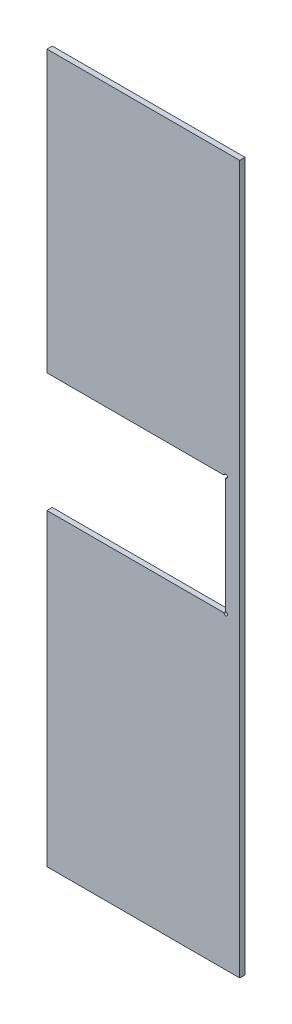
ISO-10303-21;
HEADER;
FILE_DESCRIPTION(('STEP AP214'),'2;1');
FILE_NAME('part.step','',(''),(''),'','','');
FILE_SCHEMA(('AUTOMOTIVE_DESIGN { 1 0 10303 214 1 1 1 1 }'));
ENDSEC;
DATA;
#1=APPLICATION_CONTEXT('core data for automotive mechanical design processes');
#2=APPLICATION_PROTOCOL_DEFINITION('international standard','automotive_design',2000,#1);
#3=PRODUCT_CONTEXT('',#1,'mechanical');
#4=PRODUCT('Part','Part','',(#3));
#5=PRODUCT_RELATED_PRODUCT_CATEGORY('part','',(#4));
#6=PRODUCT_DEFINITION_FORMATION('','',#4);
#7=PRODUCT_DEFINITION_CONTEXT('part definition',#1,'design');
#8=PRODUCT_DEFINITION('design','',#6,#7);
#9=PRODUCT_DEFINITION_SHAPE('','',#8);
#10=(LENGTH_UNIT() NAMED_UNIT(*) SI_UNIT(.MILLI.,.METRE.));
#11=(NAMED_UNIT(*) PLANE_ANGLE_UNIT() SI_UNIT($,.RADIAN.));
#12=(NAMED_UNIT(*) SI_UNIT($,.STERADIAN.) SOLID_ANGLE_UNIT());
#13=UNCERTAINTY_MEASURE_WITH_UNIT(LENGTH_MEASURE(1.E-05),#10,'distance_accuracy_value','');
#14=(GEOMETRIC_REPRESENTATION_CONTEXT(3) GLOBAL_UNCERTAINTY_ASSIGNED_CONTEXT((#13)) GLOBAL_UNIT_ASSIGNED_CONTEXT((#10,
#11,#12)) REPRESENTATION_CONTEXT('',''));
#15=CARTESIAN_POINT('',(0.,0.,0.));
#16=DIRECTION('',(0.,0.,1.));
#17=DIRECTION('',(1.,0.,0.));
#18=AXIS2_PLACEMENT_3D('',#15,#16,#17);
#19=CARTESIAN_POINT('',(13.75,-50.5,0.76));
#20=DIRECTION('',(-1.,0.,0.));
#21=DIRECTION('',(0.,0.,1.));
#22=AXIS2_PLACEMENT_3D('',#19,#20,#21);
#23=PLANE('',#22);
#24=DIRECTION('',(0.,1.,0.));
#25=VECTOR('',#24,1.);
#26=CARTESIAN_POINT('',(13.75,-50.5,0.));
#27=LINE('',#26,#25);
#28=CARTESIAN_POINT('',(13.75,-50.5,0.));
#29=VERTEX_POINT('',#28);
#30=CARTESIAN_POINT('',(13.75,50.5,0.));
#31=VERTEX_POINT('',#30);
#32=EDGE_CURVE('E155',#29,#31,#27,.T.);
#33=ORIENTED_EDGE('',*,*,#32,.T.);
#34=DIRECTION('',(0.,0.,-1.));
#35=VECTOR('',#34,1.);
#36=CARTESIAN_POINT('',(13.75,50.5,0.76));
#37=LINE('',#36,#35);
#38=CARTESIAN_POINT('',(13.75,50.5,0.76));
#39=VERTEX_POINT('',#38);
#40=EDGE_CURVE('E200',#39,#31,#37,.T.);
#41=ORIENTED_EDGE('',*,*,#40,.F.);
#42=DIRECTION('',(0.,1.,0.));
#43=VECTOR('',#42,1.);
#44=CARTESIAN_POINT('',(13.75,-50.5,0.76));
#45=LINE('',#44,#43);
#46=CARTESIAN_POINT('',(13.75,-50.5,0.76));
#47=VERTEX_POINT('',#46);
#48=EDGE_CURVE('E180',#47,#39,#45,.T.);
#49=ORIENTED_EDGE('',*,*,#48,.F.);
#50=DIRECTION('',(0.,0.,-1.));
#51=VECTOR('',#50,1.);
#52=CARTESIAN_POINT('',(13.75,-50.5,0.76));
#53=LINE('',#52,#51);
#54=EDGE_CURVE('E154',#47,#29,#53,.T.);
#55=ORIENTED_EDGE('',*,*,#54,.T.);
#56=EDGE_LOOP('',(#33,#41,#49,#55));
#57=FACE_BOUND('',#56,.T.);
#58=ADVANCED_FACE('F39',(#57),#23,.F.);
#59=CARTESIAN_POINT('',(-13.75,50.5,0.76));
#60=DIRECTION('',(0.,-1.,0.));
#61=DIRECTION('',(0.,0.,-1.));
#62=AXIS2_PLACEMENT_3D('',#59,#60,#61);
#63=PLANE('',#62);
#64=DIRECTION('',(-1.,0.,0.));
#65=VECTOR('',#64,1.);
#66=CARTESIAN_POINT('',(-13.75,50.5,0.));
#67=LINE('',#66,#65);
#68=CARTESIAN_POINT('',(-13.75,50.5,0.));
#69=VERTEX_POINT('',#68);
#70=EDGE_CURVE('E159',#31,#69,#67,.T.);
#71=ORIENTED_EDGE('',*,*,#70,.T.);
#72=DIRECTION('',(0.,0.,-1.));
#73=VECTOR('',#72,1.);
#74=CARTESIAN_POINT('',(-13.75,50.5,0.76));
#75=LINE('',#74,#73);
#76=CARTESIAN_POINT('',(-13.75,50.5,0.76));
#77=VERTEX_POINT('',#76);
#78=EDGE_CURVE('E196',#77,#69,#75,.T.);
#79=ORIENTED_EDGE('',*,*,#78,.F.);
#80=DIRECTION('',(-1.,0.,0.));
#81=VECTOR('',#80,1.);
#82=CARTESIAN_POINT('',(-13.75,50.5,0.76));
#83=LINE('',#82,#81);
#84=EDGE_CURVE('E226',#39,#77,#83,.T.);
#85=ORIENTED_EDGE('',*,*,#84,.F.);
#86=ORIENTED_EDGE('',*,*,#40,.T.);
#87=EDGE_LOOP('',(#71,#79,#85,#86));
#88=FACE_BOUND('',#87,.T.);
#89=ADVANCED_FACE('F232',(#88),#63,.F.);
#90=CARTESIAN_POINT('',(-13.75,10.5,0.76));
#91=DIRECTION('',(1.,0.,0.));
#92=DIRECTION('',(0.,1.,0.));
#93=AXIS2_PLACEMENT_3D('',#90,#91,#92);
#94=PLANE('',#93);
#95=DIRECTION('',(0.,-1.,0.));
#96=VECTOR('',#95,1.);
#97=CARTESIAN_POINT('',(-13.75,10.5,0.));
#98=LINE('',#97,#96);
#99=CARTESIAN_POINT('',(-13.75,10.5,0.));
#100=VERTEX_POINT('',#99);
#101=EDGE_CURVE('E162',#69,#100,#98,.T.);
#102=ORIENTED_EDGE('',*,*,#101,.T.);
#103=DIRECTION('',(0.,0.,-1.));
#104=VECTOR('',#103,1.);
#105=CARTESIAN_POINT('',(-13.75,10.5,0.76));
#106=LINE('',#105,#104);
#107=CARTESIAN_POINT('',(-13.75,10.5,0.76));
#108=VERTEX_POINT('',#107);
#109=EDGE_CURVE('E192',#108,#100,#106,.T.);
#110=ORIENTED_EDGE('',*,*,#109,.F.);
#111=DIRECTION('',(0.,-1.,0.));
#112=VECTOR('',#111,1.);
#113=CARTESIAN_POINT('',(-13.75,10.5,0.76));
#114=LINE('',#113,#112);
#115=EDGE_CURVE('E145',#77,#108,#114,.T.);
#116=ORIENTED_EDGE('',*,*,#115,.F.);
#117=ORIENTED_EDGE('',*,*,#78,.T.);
#118=EDGE_LOOP('',(#102,#110,#116,#117));
#119=FACE_BOUND('',#118,.T.);
#120=ADVANCED_FACE('F250',(#119),#94,.F.);
#121=CARTESIAN_POINT('',(11.75,10.5,0.76));
#122=DIRECTION('',(0.,1.,0.));
#123=DIRECTION('',(-1.,0.,0.));
#124=AXIS2_PLACEMENT_3D('',#121,#122,#123);
#125=PLANE('',#124);
#126=DIRECTION('',(1.,0.,0.));
#127=VECTOR('',#126,1.);
#128=CARTESIAN_POINT('',(11.75,10.5,0.));
#129=LINE('',#128,#127);
#130=CARTESIAN_POINT('',(11.5,10.5,0.));
#131=VERTEX_POINT('',#130);
#132=EDGE_CURVE('E165',#100,#131,#129,.T.);
#133=ORIENTED_EDGE('',*,*,#132,.T.);
#134=DIRECTION('',(0.,0.,1.));
#135=VECTOR('',#134,1.);
#136=CARTESIAN_POINT('',(11.5,10.5,-9.24));
#137=LINE('',#136,#135);
#138=CARTESIAN_POINT('',(11.5,10.5,0.76));
#139=VERTEX_POINT('',#138);
#140=EDGE_CURVE('E53',#131,#139,#137,.T.);
#141=ORIENTED_EDGE('',*,*,#140,.T.);
#142=DIRECTION('',(1.,0.,0.));
#143=VECTOR('',#142,1.);
#144=CARTESIAN_POINT('',(11.75,10.5,0.76));
#145=LINE('',#144,#143);
#146=EDGE_CURVE('E139',#108,#139,#145,.T.);
#147=ORIENTED_EDGE('',*,*,#146,.F.);
#148=ORIENTED_EDGE('',*,*,#109,.T.);
#149=EDGE_LOOP('',(#133,#141,#147,#148));
#150=FACE_BOUND('',#149,.T.);
#151=ADVANCED_FACE('F246',(#150),#125,.F.);
#152=CARTESIAN_POINT('',(11.75,-6.50000000000001,0.76));
#153=DIRECTION('',(1.,0.,0.));
#154=DIRECTION('',(0.,0.,-1.));
#155=AXIS2_PLACEMENT_3D('',#152,#153,#154);
#156=PLANE('',#155);
#157=DIRECTION('',(0.,-1.,0.));
#158=VECTOR('',#157,1.);
#159=CARTESIAN_POINT('',(11.75,-6.50000000000001,0.76));
#160=LINE('',#159,#158);
#161=CARTESIAN_POINT('',(11.75,10.25,0.76));
#162=VERTEX_POINT('',#161);
#163=CARTESIAN_POINT('',(11.75,-6.25000000000001,0.76));
#164=VERTEX_POINT('',#163);
#165=EDGE_CURVE('E128',#162,#164,#160,.T.);
#166=ORIENTED_EDGE('',*,*,#165,.F.);
#167=DIRECTION('',(0.,0.,1.));
#168=VECTOR('',#167,1.);
#169=CARTESIAN_POINT('',(11.75,10.25,-9.24));
#170=LINE('',#169,#168);
#171=CARTESIAN_POINT('',(11.75,10.25,0.));
#172=VERTEX_POINT('',#171);
#173=EDGE_CURVE('E132',#162,#172,#170,.F.);
#174=ORIENTED_EDGE('',*,*,#173,.T.);
#175=DIRECTION('',(0.,-1.,0.));
#176=VECTOR('',#175,1.);
#177=CARTESIAN_POINT('',(11.75,-6.50000000000001,0.));
#178=LINE('',#177,#176);
#179=CARTESIAN_POINT('',(11.75,-6.25000000000001,0.));
#180=VERTEX_POINT('',#179);
#181=EDGE_CURVE('E130',#172,#180,#178,.T.);
#182=ORIENTED_EDGE('',*,*,#181,.T.);
#183=DIRECTION('',(0.,0.,1.));
#184=VECTOR('',#183,1.);
#185=CARTESIAN_POINT('',(11.75,-6.25000000000001,-9.24));
#186=LINE('',#185,#184);
#187=EDGE_CURVE('E61',#180,#164,#186,.T.);
#188=ORIENTED_EDGE('',*,*,#187,.T.);
#189=EDGE_LOOP('',(#166,#174,#182,#188));
#190=FACE_BOUND('',#189,.T.);
#191=ADVANCED_FACE('F126',(#190),#156,.F.);
#192=CARTESIAN_POINT('',(-13.75,-6.50000000000001,0.76));
#193=DIRECTION('',(0.,-1.,0.));
#194=DIRECTION('',(0.,0.,-1.));
#195=AXIS2_PLACEMENT_3D('',#192,#193,#194);
#196=PLANE('',#195);
#197=DIRECTION('',(-1.,0.,0.));
#198=VECTOR('',#197,1.);
#199=CARTESIAN_POINT('',(-13.75,-6.50000000000001,0.76));
#200=LINE('',#199,#198);
#201=CARTESIAN_POINT('',(11.5,-6.50000000000001,0.76));
#202=VERTEX_POINT('',#201);
#203=CARTESIAN_POINT('',(-13.75,-6.50000000000001,0.76));
#204=VERTEX_POINT('',#203);
#205=EDGE_CURVE('E138',#202,#204,#200,.T.);
#206=ORIENTED_EDGE('',*,*,#205,.F.);
#207=DIRECTION('',(0.,0.,1.));
#208=VECTOR('',#207,1.);
#209=CARTESIAN_POINT('',(11.5,-6.50000000000001,-9.24));
#210=LINE('',#209,#208);
#211=CARTESIAN_POINT('',(11.5,-6.50000000000001,0.));
#212=VERTEX_POINT('',#211);
#213=EDGE_CURVE('E116',#202,#212,#210,.F.);
#214=ORIENTED_EDGE('',*,*,#213,.T.);
#215=DIRECTION('',(-1.,0.,0.));
#216=VECTOR('',#215,1.);
#217=CARTESIAN_POINT('',(-13.75,-6.50000000000001,0.));
#218=LINE('',#217,#216);
#219=CARTESIAN_POINT('',(-13.75,-6.50000000000001,0.));
#220=VERTEX_POINT('',#219);
#221=EDGE_CURVE('E171',#212,#220,#218,.T.);
#222=ORIENTED_EDGE('',*,*,#221,.T.);
#223=DIRECTION('',(0.,0.,-1.));
#224=VECTOR('',#223,1.);
#225=CARTESIAN_POINT('',(-13.75,-6.50000000000001,0.76));
#226=LINE('',#225,#224);
#227=EDGE_CURVE('E188',#204,#220,#226,.T.);
#228=ORIENTED_EDGE('',*,*,#227,.F.);
#229=EDGE_LOOP('',(#206,#214,#222,#228));
#230=FACE_BOUND('',#229,.T.);
#231=ADVANCED_FACE('F207',(#230),#196,.F.);
#232=CARTESIAN_POINT('',(-13.75,-50.5,0.76));
#233=DIRECTION('',(1.,0.,0.));
#234=DIRECTION('',(0.,0.,-1.));
#235=AXIS2_PLACEMENT_3D('',#232,#233,#234);
#236=PLANE('',#235);
#237=DIRECTION('',(0.,-1.,0.));
#238=VECTOR('',#237,1.);
#239=CARTESIAN_POINT('',(-13.75,-50.5,0.));
#240=LINE('',#239,#238);
#241=CARTESIAN_POINT('',(-13.75,-50.5,0.));
#242=VERTEX_POINT('',#241);
#243=EDGE_CURVE('E174',#220,#242,#240,.T.);
#244=ORIENTED_EDGE('',*,*,#243,.T.);
#245=DIRECTION('',(0.,0.,-1.));
#246=VECTOR('',#245,1.);
#247=CARTESIAN_POINT('',(-13.75,-50.5,0.76));
#248=LINE('',#247,#246);
#249=CARTESIAN_POINT('',(-13.75,-50.5,0.76));
#250=VERTEX_POINT('',#249);
#251=EDGE_CURVE('E184',#250,#242,#248,.T.);
#252=ORIENTED_EDGE('',*,*,#251,.F.);
#253=DIRECTION('',(0.,-1.,0.));
#254=VECTOR('',#253,1.);
#255=CARTESIAN_POINT('',(-13.75,-50.5,0.76));
#256=LINE('',#255,#254);
#257=EDGE_CURVE('E143',#204,#250,#256,.T.);
#258=ORIENTED_EDGE('',*,*,#257,.F.);
#259=ORIENTED_EDGE('',*,*,#227,.T.);
#260=EDGE_LOOP('',(#244,#252,#258,#259));
#261=FACE_BOUND('',#260,.T.);
#262=ADVANCED_FACE('F217',(#261),#236,.F.);
#263=CARTESIAN_POINT('',(-13.75,-50.5,0.76));
#264=DIRECTION('',(0.,1.,0.));
#265=DIRECTION('',(0.,0.,1.));
#266=AXIS2_PLACEMENT_3D('',#263,#264,#265);
#267=PLANE('',#266);
#268=DIRECTION('',(1.,0.,0.));
#269=VECTOR('',#268,1.);
#270=CARTESIAN_POINT('',(-13.75,-50.5,0.));
#271=LINE('',#270,#269);
#272=EDGE_CURVE('E177',#242,#29,#271,.T.);
#273=ORIENTED_EDGE('',*,*,#272,.T.);
#274=ORIENTED_EDGE('',*,*,#54,.F.);
#275=DIRECTION('',(1.,0.,0.));
#276=VECTOR('',#275,1.);
#277=CARTESIAN_POINT('',(-13.75,-50.5,0.76));
#278=LINE('',#277,#276);
#279=EDGE_CURVE('E151',#250,#47,#278,.T.);
#280=ORIENTED_EDGE('',*,*,#279,.F.);
#281=ORIENTED_EDGE('',*,*,#251,.T.);
#282=EDGE_LOOP('',(#273,#274,#280,#281));
#283=FACE_BOUND('',#282,.T.);
#284=ADVANCED_FACE('F221',(#283),#267,.F.);
#285=CARTESIAN_POINT('',(0.,0.,0.76));
#286=DIRECTION('',(0.,0.,-1.));
#287=DIRECTION('',(-1.,0.,0.));
#288=AXIS2_PLACEMENT_3D('',#285,#286,#287);
#289=PLANE('',#288);
#290=ORIENTED_EDGE('',*,*,#146,.T.);
#291=CARTESIAN_POINT('',(11.75,10.5,0.76));
#292=DIRECTION('',(0.,0.,1.));
#293=DIRECTION('',(1.,0.,0.));
#294=AXIS2_PLACEMENT_3D('',#291,#292,#293);
#295=CIRCLE('',#294,0.25);
#296=EDGE_CURVE('E121',#162,#139,#295,.T.);
#297=ORIENTED_EDGE('',*,*,#296,.F.);
#298=ORIENTED_EDGE('',*,*,#165,.T.);
#299=CARTESIAN_POINT('',(11.75,-6.50000000000001,0.76));
#300=DIRECTION('',(0.,0.,1.));
#301=DIRECTION('',(1.,0.,0.));
#302=AXIS2_PLACEMENT_3D('',#299,#300,#301);
#303=CIRCLE('',#302,0.25);
#304=EDGE_CURVE('E113',#202,#164,#303,.T.);
#305=ORIENTED_EDGE('',*,*,#304,.F.);
#306=ORIENTED_EDGE('',*,*,#205,.T.);
#307=ORIENTED_EDGE('',*,*,#257,.T.);
#308=ORIENTED_EDGE('',*,*,#279,.T.);
#309=ORIENTED_EDGE('',*,*,#48,.T.);
#310=ORIENTED_EDGE('',*,*,#84,.T.);
#311=ORIENTED_EDGE('',*,*,#115,.T.);
#312=EDGE_LOOP('',(#290,#297,#298,#305,#306,#307,#308,#309,#310,#311));
#313=FACE_BOUND('',#312,.T.);
#314=ADVANCED_FACE('F136',(#313),#289,.F.);
#315=CARTESIAN_POINT('',(0.,0.,0.));
#316=DIRECTION('',(0.,0.,-1.));
#317=DIRECTION('',(-1.,0.,0.));
#318=AXIS2_PLACEMENT_3D('',#315,#316,#317);
#319=PLANE('',#318);
#320=CARTESIAN_POINT('',(11.75,10.5,0.));
#321=DIRECTION('',(0.,0.,-1.));
#322=DIRECTION('',(-1.,0.,0.));
#323=AXIS2_PLACEMENT_3D('',#320,#321,#322);
#324=CIRCLE('',#323,0.25);
#325=EDGE_CURVE('E11',#131,#172,#324,.T.);
#326=ORIENTED_EDGE('',*,*,#325,.F.);
#327=ORIENTED_EDGE('',*,*,#132,.F.);
#328=ORIENTED_EDGE('',*,*,#101,.F.);
#329=ORIENTED_EDGE('',*,*,#70,.F.);
#330=ORIENTED_EDGE('',*,*,#32,.F.);
#331=ORIENTED_EDGE('',*,*,#272,.F.);
#332=ORIENTED_EDGE('',*,*,#243,.F.);
#333=ORIENTED_EDGE('',*,*,#221,.F.);
#334=CARTESIAN_POINT('',(11.75,-6.50000000000001,0.));
#335=DIRECTION('',(0.,0.,-1.));
#336=DIRECTION('',(-1.,0.,0.));
#337=AXIS2_PLACEMENT_3D('',#334,#335,#336);
#338=CIRCLE('',#337,0.25);
#339=EDGE_CURVE('E47',#180,#212,#338,.T.);
#340=ORIENTED_EDGE('',*,*,#339,.F.);
#341=ORIENTED_EDGE('',*,*,#181,.F.);
#342=EDGE_LOOP('',(#326,#327,#328,#329,#330,#331,#332,#333,#340,#341));
#343=FACE_BOUND('',#342,.T.);
#344=ADVANCED_FACE('F212',(#343),#319,.T.);
#345=CARTESIAN_POINT('',(11.75,-6.50000000000001,-9.24));
#346=DIRECTION('',(0.,0.,1.));
#347=DIRECTION('',(1.,0.,0.));
#348=AXIS2_PLACEMENT_3D('',#345,#346,#347);
#349=CYLINDRICAL_SURFACE('',#348,0.25);
#350=ORIENTED_EDGE('',*,*,#339,.T.);
#351=ORIENTED_EDGE('',*,*,#213,.F.);
#352=ORIENTED_EDGE('',*,*,#304,.T.);
#353=ORIENTED_EDGE('',*,*,#187,.F.);
#354=EDGE_LOOP('',(#350,#351,#352,#353));
#355=FACE_BOUND('',#354,.T.);
#356=ADVANCED_FACE('F114',(#355),#349,.F.);
#357=CARTESIAN_POINT('',(11.75,10.5,-9.24));
#358=DIRECTION('',(0.,0.,1.));
#359=DIRECTION('',(1.,0.,0.));
#360=AXIS2_PLACEMENT_3D('',#357,#358,#359);
#361=CYLINDRICAL_SURFACE('',#360,0.25);
#362=ORIENTED_EDGE('',*,*,#325,.T.);
#363=ORIENTED_EDGE('',*,*,#173,.F.);
#364=ORIENTED_EDGE('',*,*,#296,.T.);
#365=ORIENTED_EDGE('',*,*,#140,.F.);
#366=EDGE_LOOP('',(#362,#363,#364,#365));
#367=FACE_BOUND('',#366,.T.);
#368=ADVANCED_FACE('F243',(#367),#361,.F.);
#369=CLOSED_SHELL('',(#58,#89,#120,#151,#191,#231,#262,#284,#314,#344,#356,#368));
#370=MANIFOLD_SOLID_BREP('B2',#369);
#371=ADVANCED_BREP_SHAPE_REPRESENTATION('',(#18,#370),#14);
#372=SHAPE_DEFINITION_REPRESENTATION(#9,#371);
ENDSEC;
END-ISO-10303-21;
